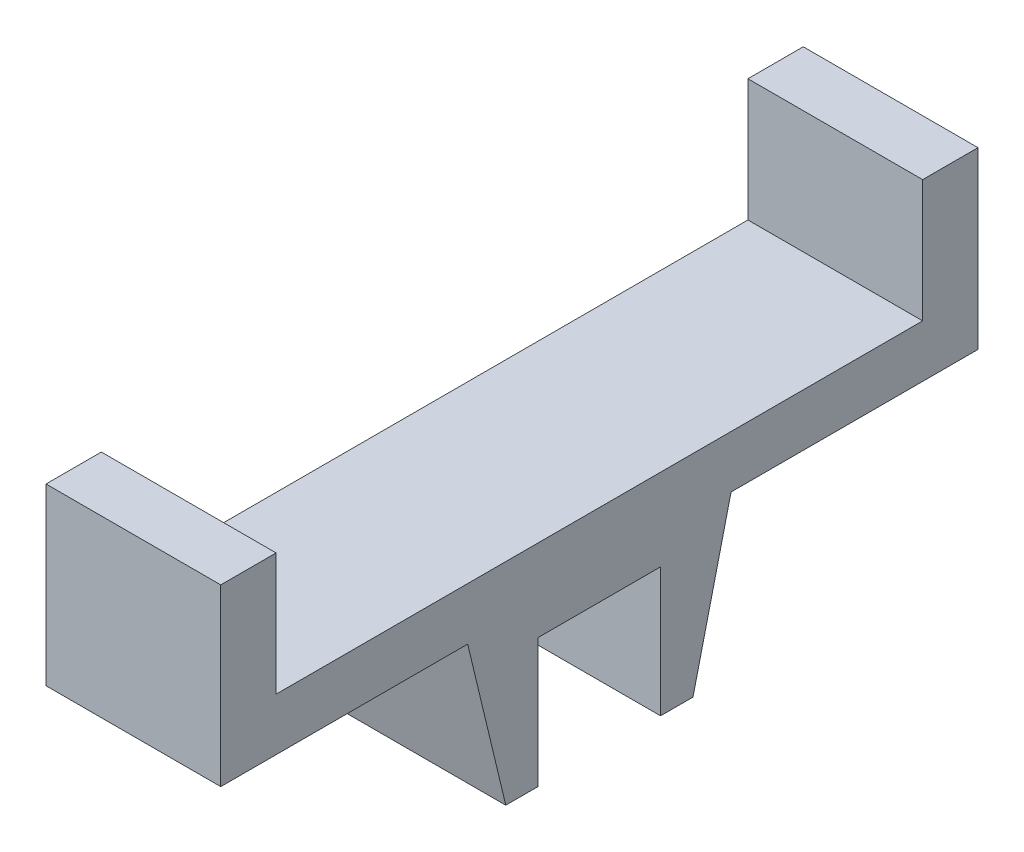
ISO-10303-21;
HEADER;
FILE_DESCRIPTION(('STEP AP214'),'2;1');
FILE_NAME('part.step','',(''),(''),'','','');
FILE_SCHEMA(('AUTOMOTIVE_DESIGN { 1 0 10303 214 1 1 1 1 }'));
ENDSEC;
DATA;
#1=APPLICATION_CONTEXT('core data for automotive mechanical design processes');
#2=APPLICATION_PROTOCOL_DEFINITION('international standard','automotive_design',2000,#1);
#3=PRODUCT_CONTEXT('',#1,'mechanical');
#4=PRODUCT('Part','Part','',(#3));
#5=PRODUCT_RELATED_PRODUCT_CATEGORY('part','',(#4));
#6=PRODUCT_DEFINITION_FORMATION('','',#4);
#7=PRODUCT_DEFINITION_CONTEXT('part definition',#1,'design');
#8=PRODUCT_DEFINITION('design','',#6,#7);
#9=PRODUCT_DEFINITION_SHAPE('','',#8);
#10=(LENGTH_UNIT() NAMED_UNIT(*) SI_UNIT(.MILLI.,.METRE.));
#11=(NAMED_UNIT(*) PLANE_ANGLE_UNIT() SI_UNIT($,.RADIAN.));
#12=(NAMED_UNIT(*) SI_UNIT($,.STERADIAN.) SOLID_ANGLE_UNIT());
#13=UNCERTAINTY_MEASURE_WITH_UNIT(LENGTH_MEASURE(1.E-05),#10,'distance_accuracy_value','');
#14=(GEOMETRIC_REPRESENTATION_CONTEXT(3) GLOBAL_UNCERTAINTY_ASSIGNED_CONTEXT((#13)) GLOBAL_UNIT_ASSIGNED_CONTEXT((#10,
#11,#12)) REPRESENTATION_CONTEXT('',''));
#15=CARTESIAN_POINT('',(0.,0.,0.));
#16=DIRECTION('',(0.,0.,1.));
#17=DIRECTION('',(1.,0.,0.));
#18=AXIS2_PLACEMENT_3D('',#15,#16,#17);
#19=CARTESIAN_POINT('',(0.,0.,0.));
#20=DIRECTION('',(0.,1.,0.));
#21=DIRECTION('',(0.,0.,1.));
#22=AXIS2_PLACEMENT_3D('',#19,#20,#21);
#23=PLANE('',#22);
#24=DIRECTION('',(-1.,0.,0.));
#25=VECTOR('',#24,1.);
#26=CARTESIAN_POINT('',(25.5472350230415,0.,-17.3067511520737));
#27=LINE('',#26,#25);
#28=CARTESIAN_POINT('',(25.5472350230415,0.,-17.3067511520737));
#29=VERTEX_POINT('',#28);
#30=CARTESIAN_POINT('',(10.5472350230415,0.,-17.3067511520737));
#31=VERTEX_POINT('',#30);
#32=EDGE_CURVE('E214',#29,#31,#27,.T.);
#33=ORIENTED_EDGE('',*,*,#32,.F.);
#34=DIRECTION('',(0.,0.,-1.));
#35=VECTOR('',#34,1.);
#36=CARTESIAN_POINT('',(25.5472350230415,0.,3.88824884792627));
#37=LINE('',#36,#35);
#38=CARTESIAN_POINT('',(25.5472350230415,0.,3.88824884792627));
#39=VERTEX_POINT('',#38);
#40=EDGE_CURVE('E180',#39,#29,#37,.T.);
#41=ORIENTED_EDGE('',*,*,#40,.F.);
#42=DIRECTION('',(1.,0.,0.));
#43=VECTOR('',#42,1.);
#44=CARTESIAN_POINT('',(10.5472350230415,0.,3.88824884792627));
#45=LINE('',#44,#43);
#46=CARTESIAN_POINT('',(10.5472350230415,0.,3.88824884792627));
#47=VERTEX_POINT('',#46);
#48=EDGE_CURVE('E181',#47,#39,#45,.T.);
#49=ORIENTED_EDGE('',*,*,#48,.F.);
#50=DIRECTION('',(0.,0.,1.));
#51=VECTOR('',#50,1.);
#52=CARTESIAN_POINT('',(10.5472350230415,0.,-61.1117511520737));
#53=LINE('',#52,#51);
#54=EDGE_CURVE('E213',#31,#47,#53,.T.);
#55=ORIENTED_EDGE('',*,*,#54,.F.);
#56=EDGE_LOOP('',(#33,#41,#49,#55));
#57=FACE_BOUND('',#56,.T.);
#58=ADVANCED_FACE('F39',(#57),#23,.F.);
#59=CARTESIAN_POINT('',(0.,15.,0.));
#60=DIRECTION('',(0.,1.,0.));
#61=DIRECTION('',(0.,0.,1.));
#62=AXIS2_PLACEMENT_3D('',#59,#60,#61);
#63=PLANE('',#62);
#64=DIRECTION('',(-1.,0.,0.));
#65=VECTOR('',#64,1.);
#66=CARTESIAN_POINT('',(25.5472350230415,15.,-0.861751152073741));
#67=LINE('',#66,#65);
#68=CARTESIAN_POINT('',(25.5472350230415,15.,-0.861751152073741));
#69=VERTEX_POINT('',#68);
#70=CARTESIAN_POINT('',(10.5472350230415,15.,-0.861751152073738));
#71=VERTEX_POINT('',#70);
#72=EDGE_CURVE('E232',#69,#71,#67,.T.);
#73=ORIENTED_EDGE('',*,*,#72,.T.);
#74=DIRECTION('',(0.,0.,1.));
#75=VECTOR('',#74,1.);
#76=CARTESIAN_POINT('',(10.5472350230415,15.,-61.1117511520737));
#77=LINE('',#76,#75);
#78=CARTESIAN_POINT('',(10.5472350230415,15.,3.88824884792627));
#79=VERTEX_POINT('',#78);
#80=EDGE_CURVE('E300',#71,#79,#77,.T.);
#81=ORIENTED_EDGE('',*,*,#80,.T.);
#82=DIRECTION('',(1.,0.,0.));
#83=VECTOR('',#82,1.);
#84=CARTESIAN_POINT('',(10.5472350230415,15.,3.88824884792627));
#85=LINE('',#84,#83);
#86=CARTESIAN_POINT('',(25.5472350230415,15.,3.88824884792627));
#87=VERTEX_POINT('',#86);
#88=EDGE_CURVE('E206',#79,#87,#85,.T.);
#89=ORIENTED_EDGE('',*,*,#88,.T.);
#90=DIRECTION('',(0.,0.,-1.));
#91=VECTOR('',#90,1.);
#92=CARTESIAN_POINT('',(25.5472350230415,15.,3.88824884792627));
#93=LINE('',#92,#91);
#94=EDGE_CURVE('E195',#87,#69,#93,.T.);
#95=ORIENTED_EDGE('',*,*,#94,.T.);
#96=EDGE_LOOP('',(#73,#81,#89,#95));
#97=FACE_BOUND('',#96,.T.);
#98=ADVANCED_FACE('F307',(#97),#63,.T.);
#99=CARTESIAN_POINT('',(25.5472350230415,15.,-61.1117511520737));
#100=DIRECTION('',(0.,0.,1.));
#101=DIRECTION('',(1.,0.,0.));
#102=AXIS2_PLACEMENT_3D('',#99,#100,#101);
#103=PLANE('',#102);
#104=DIRECTION('',(-1.,0.,0.));
#105=VECTOR('',#104,1.);
#106=CARTESIAN_POINT('',(25.5472350230415,0.,-61.1117511520737));
#107=LINE('',#106,#105);
#108=CARTESIAN_POINT('',(25.5472350230415,0.,-61.1117511520737));
#109=VERTEX_POINT('',#108);
#110=CARTESIAN_POINT('',(10.5472350230415,0.,-61.1117511520737));
#111=VERTEX_POINT('',#110);
#112=EDGE_CURVE('E178',#109,#111,#107,.T.);
#113=ORIENTED_EDGE('',*,*,#112,.T.);
#114=DIRECTION('',(0.,-1.,0.));
#115=VECTOR('',#114,1.);
#116=CARTESIAN_POINT('',(10.5472350230415,15.,-61.1117511520737));
#117=LINE('',#116,#115);
#118=CARTESIAN_POINT('',(10.5472350230415,15.,-61.1117511520737));
#119=VERTEX_POINT('',#118);
#120=EDGE_CURVE('E11',#119,#111,#117,.T.);
#121=ORIENTED_EDGE('',*,*,#120,.F.);
#122=DIRECTION('',(-1.,0.,0.));
#123=VECTOR('',#122,1.);
#124=CARTESIAN_POINT('',(25.5472350230415,15.,-61.1117511520737));
#125=LINE('',#124,#123);
#126=CARTESIAN_POINT('',(25.5472350230415,15.,-61.1117511520737));
#127=VERTEX_POINT('',#126);
#128=EDGE_CURVE('E186',#127,#119,#125,.T.);
#129=ORIENTED_EDGE('',*,*,#128,.F.);
#130=DIRECTION('',(0.,-1.,0.));
#131=VECTOR('',#130,1.);
#132=CARTESIAN_POINT('',(25.5472350230415,15.,-61.1117511520737));
#133=LINE('',#132,#131);
#134=EDGE_CURVE('E191',#127,#109,#133,.T.);
#135=ORIENTED_EDGE('',*,*,#134,.T.);
#136=EDGE_LOOP('',(#113,#121,#129,#135));
#137=FACE_BOUND('',#136,.T.);
#138=ADVANCED_FACE('F41',(#137),#103,.F.);
#139=CARTESIAN_POINT('',(10.5472350230415,15.,-61.1117511520737));
#140=DIRECTION('',(1.,0.,0.));
#141=DIRECTION('',(0.,0.,-1.));
#142=AXIS2_PLACEMENT_3D('',#139,#140,#141);
#143=PLANE('',#142);
#144=ORIENTED_EDGE('',*,*,#80,.F.);
#145=DIRECTION('',(0.,1.,0.));
#146=VECTOR('',#145,1.);
#147=CARTESIAN_POINT('',(10.5472350230415,4.5,-0.861751152073738));
#148=LINE('',#147,#146);
#149=CARTESIAN_POINT('',(10.5472350230415,4.5,-0.861751152073738));
#150=VERTEX_POINT('',#149);
#151=EDGE_CURVE('E273',#150,#71,#148,.T.);
#152=ORIENTED_EDGE('',*,*,#151,.F.);
#153=DIRECTION('',(0.,0.,1.));
#154=VECTOR('',#153,1.);
#155=CARTESIAN_POINT('',(10.5472350230415,4.5,-56.3617511520737));
#156=LINE('',#155,#154);
#157=CARTESIAN_POINT('',(10.5472350230415,4.5,-56.3617511520737));
#158=VERTEX_POINT('',#157);
#159=EDGE_CURVE('E282',#158,#150,#156,.T.);
#160=ORIENTED_EDGE('',*,*,#159,.F.);
#161=DIRECTION('',(0.,-1.,0.));
#162=VECTOR('',#161,1.);
#163=CARTESIAN_POINT('',(10.5472350230415,15.,-56.3617511520737));
#164=LINE('',#163,#162);
#165=CARTESIAN_POINT('',(10.5472350230415,15.,-56.3617511520737));
#166=VERTEX_POINT('',#165);
#167=EDGE_CURVE('E252',#166,#158,#164,.T.);
#168=ORIENTED_EDGE('',*,*,#167,.F.);
#169=EDGE_CURVE('E301',#119,#166,#77,.T.);
#170=ORIENTED_EDGE('',*,*,#169,.F.);
#171=ORIENTED_EDGE('',*,*,#120,.T.);
#172=CARTESIAN_POINT('',(10.5472350230415,0.,-39.9168491274154));
#173=VERTEX_POINT('',#172);
#174=EDGE_CURVE('E187',#111,#173,#53,.T.);
#175=ORIENTED_EDGE('',*,*,#174,.T.);
#176=DIRECTION('',(0.,-0.972337965179243,0.233578426810118));
#177=VECTOR('',#176,1.);
#178=CARTESIAN_POINT('',(10.5472350230415,0.,-39.9168491274154));
#179=LINE('',#178,#177);
#180=CARTESIAN_POINT('',(10.5472350230415,-13.6127315125094,-36.6467511520737));
#181=VERTEX_POINT('',#180);
#182=EDGE_CURVE('E55',#173,#181,#179,.T.);
#183=ORIENTED_EDGE('',*,*,#182,.T.);
#184=DIRECTION('',(0.,0.,1.));
#185=VECTOR('',#184,1.);
#186=CARTESIAN_POINT('',(10.5472350230415,-13.6127315125094,-33.8618491274154));
#187=LINE('',#186,#185);
#188=CARTESIAN_POINT('',(10.5472350230415,-13.6127315125094,-33.8618491274154));
#189=VERTEX_POINT('',#188);
#190=EDGE_CURVE('E492',#181,#189,#187,.T.);
#191=ORIENTED_EDGE('',*,*,#190,.T.);
#192=DIRECTION('',(0.,1.,0.));
#193=VECTOR('',#192,1.);
#194=CARTESIAN_POINT('',(10.5472350230415,-2.5373737780706,-33.8618491274154));
#195=LINE('',#194,#193);
#196=CARTESIAN_POINT('',(10.5472350230415,-2.5373737780706,-33.8618491274154));
#197=VERTEX_POINT('',#196);
#198=EDGE_CURVE('E487',#189,#197,#195,.T.);
#199=ORIENTED_EDGE('',*,*,#198,.T.);
#200=DIRECTION('',(0.,0.,1.));
#201=VECTOR('',#200,1.);
#202=CARTESIAN_POINT('',(10.5472350230415,-2.5373737780706,-33.8618491274154));
#203=LINE('',#202,#201);
#204=CARTESIAN_POINT('',(10.5472350230415,-2.5373737780706,-23.3618491274154));
#205=VERTEX_POINT('',#204);
#206=EDGE_CURVE('E484',#197,#205,#203,.T.);
#207=ORIENTED_EDGE('',*,*,#206,.T.);
#208=DIRECTION('',(0.,-1.,0.));
#209=VECTOR('',#208,1.);
#210=CARTESIAN_POINT('',(10.5472350230415,-2.5373737780706,-23.3618491274154));
#211=LINE('',#210,#209);
#212=CARTESIAN_POINT('',(10.5472350230415,-13.6127315125094,-23.3618491274154));
#213=VERTEX_POINT('',#212);
#214=EDGE_CURVE('E246',#205,#213,#211,.T.);
#215=ORIENTED_EDGE('',*,*,#214,.T.);
#216=DIRECTION('',(0.,0.,1.));
#217=VECTOR('',#216,1.);
#218=CARTESIAN_POINT('',(10.5472350230415,-13.6127315125094,-23.3618491274154));
#219=LINE('',#218,#217);
#220=CARTESIAN_POINT('',(10.5472350230415,-13.6127315125094,-20.5768491274154));
#221=VERTEX_POINT('',#220);
#222=EDGE_CURVE('E241',#213,#221,#219,.T.);
#223=ORIENTED_EDGE('',*,*,#222,.T.);
#224=DIRECTION('',(0.,0.972337965179243,0.233578426810118));
#225=VECTOR('',#224,1.);
#226=CARTESIAN_POINT('',(10.5472350230415,0.,-17.3067511520737));
#227=LINE('',#226,#225);
#228=EDGE_CURVE('E173',#221,#31,#227,.T.);
#229=ORIENTED_EDGE('',*,*,#228,.T.);
#230=ORIENTED_EDGE('',*,*,#54,.T.);
#231=DIRECTION('',(0.,-1.,0.));
#232=VECTOR('',#231,1.);
#233=CARTESIAN_POINT('',(10.5472350230415,15.,3.88824884792627));
#234=LINE('',#233,#232);
#235=EDGE_CURVE('E48',#79,#47,#234,.T.);
#236=ORIENTED_EDGE('',*,*,#235,.F.);
#237=EDGE_LOOP('',(#144,#152,#160,#168,#170,#171,#175,#183,#191,#199,#207,#215,#223,#229,#230,#236));
#238=FACE_BOUND('',#237,.T.);
#239=ADVANCED_FACE('F236',(#238),#143,.F.);
#240=CARTESIAN_POINT('',(10.5472350230415,15.,3.88824884792627));
#241=DIRECTION('',(0.,0.,-1.));
#242=DIRECTION('',(-1.,0.,0.));
#243=AXIS2_PLACEMENT_3D('',#240,#241,#242);
#244=PLANE('',#243);
#245=ORIENTED_EDGE('',*,*,#48,.T.);
#246=DIRECTION('',(0.,-1.,0.));
#247=VECTOR('',#246,1.);
#248=CARTESIAN_POINT('',(25.5472350230415,15.,3.88824884792627));
#249=LINE('',#248,#247);
#250=EDGE_CURVE('E194',#87,#39,#249,.T.);
#251=ORIENTED_EDGE('',*,*,#250,.F.);
#252=ORIENTED_EDGE('',*,*,#88,.F.);
#253=ORIENTED_EDGE('',*,*,#235,.T.);
#254=EDGE_LOOP('',(#245,#251,#252,#253));
#255=FACE_BOUND('',#254,.T.);
#256=ADVANCED_FACE('F204',(#255),#244,.F.);
#257=CARTESIAN_POINT('',(25.5472350230415,15.,3.88824884792627));
#258=DIRECTION('',(-1.,0.,0.));
#259=DIRECTION('',(0.,0.,1.));
#260=AXIS2_PLACEMENT_3D('',#257,#258,#259);
#261=PLANE('',#260);
#262=DIRECTION('',(0.,0.,1.));
#263=VECTOR('',#262,1.);
#264=CARTESIAN_POINT('',(25.5472350230415,4.5,-56.3617511520737));
#265=LINE('',#264,#263);
#266=CARTESIAN_POINT('',(25.5472350230415,4.5,-56.3617511520737));
#267=VERTEX_POINT('',#266);
#268=CARTESIAN_POINT('',(25.5472350230415,4.5,-0.861751152073741));
#269=VERTEX_POINT('',#268);
#270=EDGE_CURVE('E272',#267,#269,#265,.T.);
#271=ORIENTED_EDGE('',*,*,#270,.T.);
#272=DIRECTION('',(0.,1.,0.));
#273=VECTOR('',#272,1.);
#274=CARTESIAN_POINT('',(25.5472350230415,4.5,-0.861751152073741));
#275=LINE('',#274,#273);
#276=EDGE_CURVE('E221',#269,#69,#275,.T.);
#277=ORIENTED_EDGE('',*,*,#276,.T.);
#278=ORIENTED_EDGE('',*,*,#94,.F.);
#279=ORIENTED_EDGE('',*,*,#250,.T.);
#280=ORIENTED_EDGE('',*,*,#40,.T.);
#281=DIRECTION('',(0.,0.972337965179243,0.233578426810118));
#282=VECTOR('',#281,1.);
#283=CARTESIAN_POINT('',(25.5472350230415,0.,-17.3067511520737));
#284=LINE('',#283,#282);
#285=CARTESIAN_POINT('',(25.5472350230415,-13.6127315125094,-20.5768491274154));
#286=VERTEX_POINT('',#285);
#287=EDGE_CURVE('E160',#286,#29,#284,.T.);
#288=ORIENTED_EDGE('',*,*,#287,.F.);
#289=DIRECTION('',(0.,0.,1.));
#290=VECTOR('',#289,1.);
#291=CARTESIAN_POINT('',(25.5472350230415,-13.6127315125094,-23.3618491274154));
#292=LINE('',#291,#290);
#293=CARTESIAN_POINT('',(25.5472350230415,-13.6127315125094,-23.3618491274154));
#294=VERTEX_POINT('',#293);
#295=EDGE_CURVE('E500',#294,#286,#292,.T.);
#296=ORIENTED_EDGE('',*,*,#295,.F.);
#297=DIRECTION('',(0.,-1.,0.));
#298=VECTOR('',#297,1.);
#299=CARTESIAN_POINT('',(25.5472350230415,-2.5373737780706,-23.3618491274154));
#300=LINE('',#299,#298);
#301=CARTESIAN_POINT('',(25.5472350230415,-2.5373737780706,-23.3618491274154));
#302=VERTEX_POINT('',#301);
#303=EDGE_CURVE('E503',#302,#294,#300,.T.);
#304=ORIENTED_EDGE('',*,*,#303,.F.);
#305=DIRECTION('',(0.,0.,1.));
#306=VECTOR('',#305,1.);
#307=CARTESIAN_POINT('',(25.5472350230415,-2.5373737780706,-33.8618491274154));
#308=LINE('',#307,#306);
#309=CARTESIAN_POINT('',(25.5472350230415,-2.5373737780706,-33.8618491274154));
#310=VERTEX_POINT('',#309);
#311=EDGE_CURVE('E507',#310,#302,#308,.T.);
#312=ORIENTED_EDGE('',*,*,#311,.F.);
#313=DIRECTION('',(0.,1.,0.));
#314=VECTOR('',#313,1.);
#315=CARTESIAN_POINT('',(25.5472350230415,-2.5373737780706,-33.8618491274154));
#316=LINE('',#315,#314);
#317=CARTESIAN_POINT('',(25.5472350230415,-13.6127315125094,-33.8618491274154));
#318=VERTEX_POINT('',#317);
#319=EDGE_CURVE('E511',#318,#310,#316,.T.);
#320=ORIENTED_EDGE('',*,*,#319,.F.);
#321=DIRECTION('',(0.,0.,1.));
#322=VECTOR('',#321,1.);
#323=CARTESIAN_POINT('',(25.5472350230415,-13.6127315125094,-33.8618491274154));
#324=LINE('',#323,#322);
#325=CARTESIAN_POINT('',(25.5472350230415,-13.6127315125094,-36.6467511520737));
#326=VERTEX_POINT('',#325);
#327=EDGE_CURVE('E171',#326,#318,#324,.T.);
#328=ORIENTED_EDGE('',*,*,#327,.F.);
#329=DIRECTION('',(0.,-0.972337965179243,0.233578426810118));
#330=VECTOR('',#329,1.);
#331=CARTESIAN_POINT('',(25.5472350230415,0.,-39.9168491274154));
#332=LINE('',#331,#330);
#333=CARTESIAN_POINT('',(25.5472350230415,0.,-39.9168491274154));
#334=VERTEX_POINT('',#333);
#335=EDGE_CURVE('E154',#334,#326,#332,.T.);
#336=ORIENTED_EDGE('',*,*,#335,.F.);
#337=EDGE_CURVE('E167',#334,#109,#37,.T.);
#338=ORIENTED_EDGE('',*,*,#337,.T.);
#339=ORIENTED_EDGE('',*,*,#134,.F.);
#340=CARTESIAN_POINT('',(25.5472350230415,15.,-56.3617511520737));
#341=VERTEX_POINT('',#340);
#342=EDGE_CURVE('E225',#341,#127,#93,.T.);
#343=ORIENTED_EDGE('',*,*,#342,.F.);
#344=DIRECTION('',(0.,-1.,0.));
#345=VECTOR('',#344,1.);
#346=CARTESIAN_POINT('',(25.5472350230415,15.,-56.3617511520737));
#347=LINE('',#346,#345);
#348=EDGE_CURVE('E63',#341,#267,#347,.T.);
#349=ORIENTED_EDGE('',*,*,#348,.T.);
#350=EDGE_LOOP('',(#271,#277,#278,#279,#280,#288,#296,#304,#312,#320,#328,#336,#338,#339,#343,#349));
#351=FACE_BOUND('',#350,.T.);
#352=ADVANCED_FACE('F165',(#351),#261,.F.);
#353=DIRECTION('',(-1.,0.,0.));
#354=VECTOR('',#353,1.);
#355=CARTESIAN_POINT('',(25.5472350230415,15.,-56.3617511520737));
#356=LINE('',#355,#354);
#357=EDGE_CURVE('E278',#341,#166,#356,.T.);
#358=ORIENTED_EDGE('',*,*,#357,.F.);
#359=ORIENTED_EDGE('',*,*,#342,.T.);
#360=ORIENTED_EDGE('',*,*,#128,.T.);
#361=ORIENTED_EDGE('',*,*,#169,.T.);
#362=EDGE_LOOP('',(#358,#359,#360,#361));
#363=FACE_BOUND('',#362,.T.);
#364=ADVANCED_FACE('F319',(#363),#63,.T.);
#365=ORIENTED_EDGE('',*,*,#337,.F.);
#366=DIRECTION('',(-1.,0.,0.));
#367=VECTOR('',#366,1.);
#368=CARTESIAN_POINT('',(25.5472350230415,0.,-39.9168491274154));
#369=LINE('',#368,#367);
#370=EDGE_CURVE('E151',#334,#173,#369,.T.);
#371=ORIENTED_EDGE('',*,*,#370,.T.);
#372=ORIENTED_EDGE('',*,*,#174,.F.);
#373=ORIENTED_EDGE('',*,*,#112,.F.);
#374=EDGE_LOOP('',(#365,#371,#372,#373));
#375=FACE_BOUND('',#374,.T.);
#376=ADVANCED_FACE('F176',(#375),#23,.F.);
#377=CARTESIAN_POINT('',(25.5472350230415,4.5,-0.861751152073741));
#378=DIRECTION('',(0.,0.,1.));
#379=DIRECTION('',(1.,0.,0.));
#380=AXIS2_PLACEMENT_3D('',#377,#378,#379);
#381=PLANE('',#380);
#382=ORIENTED_EDGE('',*,*,#151,.T.);
#383=ORIENTED_EDGE('',*,*,#72,.F.);
#384=ORIENTED_EDGE('',*,*,#276,.F.);
#385=DIRECTION('',(-1.,0.,0.));
#386=VECTOR('',#385,1.);
#387=CARTESIAN_POINT('',(25.5472350230415,4.5,-0.861751152073741));
#388=LINE('',#387,#386);
#389=EDGE_CURVE('E290',#269,#150,#388,.T.);
#390=ORIENTED_EDGE('',*,*,#389,.T.);
#391=EDGE_LOOP('',(#382,#383,#384,#390));
#392=FACE_BOUND('',#391,.T.);
#393=ADVANCED_FACE('F312',(#392),#381,.F.);
#394=CARTESIAN_POINT('',(25.5472350230415,4.5,-56.3617511520737));
#395=DIRECTION('',(0.,-1.,0.));
#396=DIRECTION('',(0.,0.,-1.));
#397=AXIS2_PLACEMENT_3D('',#394,#395,#396);
#398=PLANE('',#397);
#399=ORIENTED_EDGE('',*,*,#159,.T.);
#400=ORIENTED_EDGE('',*,*,#389,.F.);
#401=ORIENTED_EDGE('',*,*,#270,.F.);
#402=DIRECTION('',(-1.,0.,0.));
#403=VECTOR('',#402,1.);
#404=CARTESIAN_POINT('',(25.5472350230415,4.5,-56.3617511520737));
#405=LINE('',#404,#403);
#406=EDGE_CURVE('E293',#267,#158,#405,.T.);
#407=ORIENTED_EDGE('',*,*,#406,.T.);
#408=EDGE_LOOP('',(#399,#400,#401,#407));
#409=FACE_BOUND('',#408,.T.);
#410=ADVANCED_FACE('F315',(#409),#398,.F.);
#411=CARTESIAN_POINT('',(25.5472350230415,15.,-56.3617511520737));
#412=DIRECTION('',(0.,0.,-1.));
#413=DIRECTION('',(-1.,0.,0.));
#414=AXIS2_PLACEMENT_3D('',#411,#412,#413);
#415=PLANE('',#414);
#416=ORIENTED_EDGE('',*,*,#167,.T.);
#417=ORIENTED_EDGE('',*,*,#406,.F.);
#418=ORIENTED_EDGE('',*,*,#348,.F.);
#419=ORIENTED_EDGE('',*,*,#357,.T.);
#420=EDGE_LOOP('',(#416,#417,#418,#419));
#421=FACE_BOUND('',#420,.T.);
#422=ADVANCED_FACE('F316',(#421),#415,.F.);
#423=CARTESIAN_POINT('',(25.5472350230415,0.,-17.3067511520737));
#424=DIRECTION('',(0.,-0.233578426810118,0.972337965179243));
#425=DIRECTION('',(0.,-0.972337965179243,-0.233578426810118));
#426=AXIS2_PLACEMENT_3D('',#423,#424,#425);
#427=PLANE('',#426);
#428=ORIENTED_EDGE('',*,*,#228,.F.);
#429=DIRECTION('',(-1.,0.,0.));
#430=VECTOR('',#429,1.);
#431=CARTESIAN_POINT('',(25.5472350230415,-13.6127315125094,-20.5768491274154));
#432=LINE('',#431,#430);
#433=EDGE_CURVE('E253',#286,#221,#432,.T.);
#434=ORIENTED_EDGE('',*,*,#433,.F.);
#435=ORIENTED_EDGE('',*,*,#287,.T.);
#436=ORIENTED_EDGE('',*,*,#32,.T.);
#437=EDGE_LOOP('',(#428,#434,#435,#436));
#438=FACE_BOUND('',#437,.T.);
#439=ADVANCED_FACE('F345',(#438),#427,.T.);
#440=CARTESIAN_POINT('',(25.5472350230415,-13.6127315125094,-23.3618491274154));
#441=DIRECTION('',(0.,-1.,0.));
#442=DIRECTION('',(0.,0.,-1.));
#443=AXIS2_PLACEMENT_3D('',#440,#441,#442);
#444=PLANE('',#443);
#445=ORIENTED_EDGE('',*,*,#222,.F.);
#446=DIRECTION('',(-1.,0.,0.));
#447=VECTOR('',#446,1.);
#448=CARTESIAN_POINT('',(25.5472350230415,-13.6127315125094,-23.3618491274154));
#449=LINE('',#448,#447);
#450=EDGE_CURVE('E256',#294,#213,#449,.T.);
#451=ORIENTED_EDGE('',*,*,#450,.F.);
#452=ORIENTED_EDGE('',*,*,#295,.T.);
#453=ORIENTED_EDGE('',*,*,#433,.T.);
#454=EDGE_LOOP('',(#445,#451,#452,#453));
#455=FACE_BOUND('',#454,.T.);
#456=ADVANCED_FACE('F365',(#455),#444,.T.);
#457=CARTESIAN_POINT('',(25.5472350230415,-2.5373737780706,-23.3618491274154));
#458=DIRECTION('',(0.,0.,-1.));
#459=DIRECTION('',(0.,1.,0.));
#460=AXIS2_PLACEMENT_3D('',#457,#458,#459);
#461=PLANE('',#460);
#462=ORIENTED_EDGE('',*,*,#214,.F.);
#463=DIRECTION('',(-1.,0.,0.));
#464=VECTOR('',#463,1.);
#465=CARTESIAN_POINT('',(25.5472350230415,-2.5373737780706,-23.3618491274154));
#466=LINE('',#465,#464);
#467=EDGE_CURVE('E259',#302,#205,#466,.T.);
#468=ORIENTED_EDGE('',*,*,#467,.F.);
#469=ORIENTED_EDGE('',*,*,#303,.T.);
#470=ORIENTED_EDGE('',*,*,#450,.T.);
#471=EDGE_LOOP('',(#462,#468,#469,#470));
#472=FACE_BOUND('',#471,.T.);
#473=ADVANCED_FACE('F361',(#472),#461,.T.);
#474=CARTESIAN_POINT('',(25.5472350230415,-2.5373737780706,-33.8618491274154));
#475=DIRECTION('',(0.,-1.,0.));
#476=DIRECTION('',(0.,0.,-1.));
#477=AXIS2_PLACEMENT_3D('',#474,#475,#476);
#478=PLANE('',#477);
#479=ORIENTED_EDGE('',*,*,#206,.F.);
#480=DIRECTION('',(-1.,0.,0.));
#481=VECTOR('',#480,1.);
#482=CARTESIAN_POINT('',(25.5472350230415,-2.5373737780706,-33.8618491274154));
#483=LINE('',#482,#481);
#484=EDGE_CURVE('E262',#310,#197,#483,.T.);
#485=ORIENTED_EDGE('',*,*,#484,.F.);
#486=ORIENTED_EDGE('',*,*,#311,.T.);
#487=ORIENTED_EDGE('',*,*,#467,.T.);
#488=EDGE_LOOP('',(#479,#485,#486,#487));
#489=FACE_BOUND('',#488,.T.);
#490=ADVANCED_FACE('F357',(#489),#478,.T.);
#491=CARTESIAN_POINT('',(25.5472350230415,-2.5373737780706,-33.8618491274154));
#492=DIRECTION('',(0.,0.,1.));
#493=DIRECTION('',(1.,0.,0.));
#494=AXIS2_PLACEMENT_3D('',#491,#492,#493);
#495=PLANE('',#494);
#496=ORIENTED_EDGE('',*,*,#198,.F.);
#497=DIRECTION('',(-1.,0.,0.));
#498=VECTOR('',#497,1.);
#499=CARTESIAN_POINT('',(25.5472350230415,-13.6127315125094,-33.8618491274154));
#500=LINE('',#499,#498);
#501=EDGE_CURVE('E265',#318,#189,#500,.T.);
#502=ORIENTED_EDGE('',*,*,#501,.F.);
#503=ORIENTED_EDGE('',*,*,#319,.T.);
#504=ORIENTED_EDGE('',*,*,#484,.T.);
#505=EDGE_LOOP('',(#496,#502,#503,#504));
#506=FACE_BOUND('',#505,.T.);
#507=ADVANCED_FACE('F353',(#506),#495,.T.);
#508=CARTESIAN_POINT('',(25.5472350230415,-13.6127315125094,-33.8618491274154));
#509=DIRECTION('',(0.,-1.,0.));
#510=DIRECTION('',(0.,0.,-1.));
#511=AXIS2_PLACEMENT_3D('',#508,#509,#510);
#512=PLANE('',#511);
#513=ORIENTED_EDGE('',*,*,#190,.F.);
#514=DIRECTION('',(-1.,0.,0.));
#515=VECTOR('',#514,1.);
#516=CARTESIAN_POINT('',(25.5472350230415,-13.6127315125094,-36.6467511520737));
#517=LINE('',#516,#515);
#518=EDGE_CURVE('E159',#326,#181,#517,.T.);
#519=ORIENTED_EDGE('',*,*,#518,.F.);
#520=ORIENTED_EDGE('',*,*,#327,.T.);
#521=ORIENTED_EDGE('',*,*,#501,.T.);
#522=EDGE_LOOP('',(#513,#519,#520,#521));
#523=FACE_BOUND('',#522,.T.);
#524=ADVANCED_FACE('F350',(#523),#512,.T.);
#525=CARTESIAN_POINT('',(25.5472350230415,0.,-39.9168491274154));
#526=DIRECTION('',(0.,-0.233578426810118,-0.972337965179243));
#527=DIRECTION('',(0.,0.972337965179243,-0.233578426810118));
#528=AXIS2_PLACEMENT_3D('',#525,#526,#527);
#529=PLANE('',#528);
#530=ORIENTED_EDGE('',*,*,#182,.F.);
#531=ORIENTED_EDGE('',*,*,#370,.F.);
#532=ORIENTED_EDGE('',*,*,#335,.T.);
#533=ORIENTED_EDGE('',*,*,#518,.T.);
#534=EDGE_LOOP('',(#530,#531,#532,#533));
#535=FACE_BOUND('',#534,.T.);
#536=ADVANCED_FACE('F153',(#535),#529,.T.);
#537=CLOSED_SHELL('',(#58,#98,#138,#239,#256,#352,#364,#376,#393,#410,#422,#439,#456,#473,#490,
#507,#524,#536));
#538=MANIFOLD_SOLID_BREP('B2',#537);
#539=ADVANCED_BREP_SHAPE_REPRESENTATION('',(#18,#538),#14);
#540=SHAPE_DEFINITION_REPRESENTATION(#9,#539);
ENDSEC;
END-ISO-10303-21;
